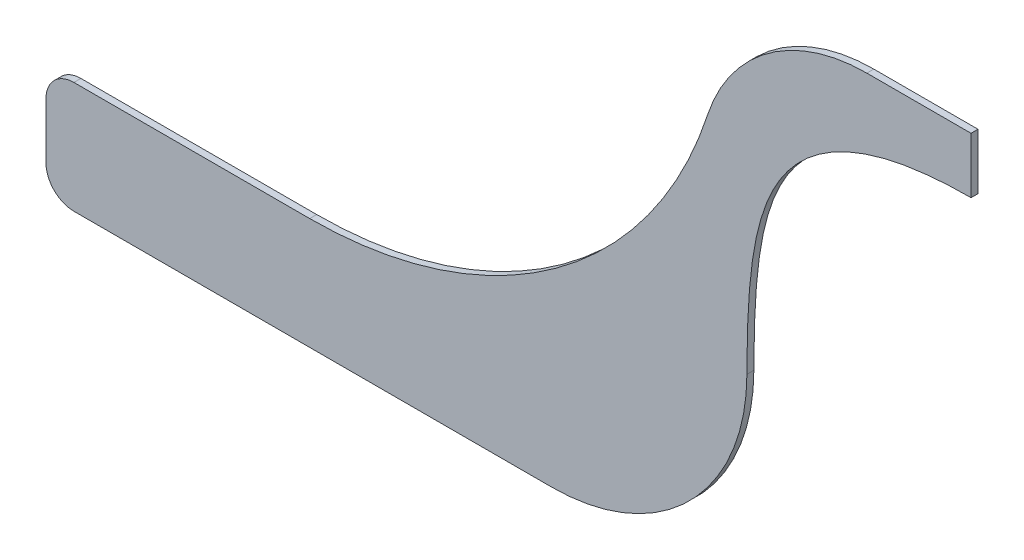
ISO-10303-21;
HEADER;
FILE_DESCRIPTION(('STEP AP214'),'2;1');
FILE_NAME('part.step','',(''),(''),'','','');
FILE_SCHEMA(('AUTOMOTIVE_DESIGN { 1 0 10303 214 1 1 1 1 }'));
ENDSEC;
DATA;
#1=APPLICATION_CONTEXT('core data for automotive mechanical design processes');
#2=APPLICATION_PROTOCOL_DEFINITION('international standard','automotive_design',2000,#1);
#3=PRODUCT_CONTEXT('',#1,'mechanical');
#4=PRODUCT('Part','Part','',(#3));
#5=PRODUCT_RELATED_PRODUCT_CATEGORY('part','',(#4));
#6=PRODUCT_DEFINITION_FORMATION('','',#4);
#7=PRODUCT_DEFINITION_CONTEXT('part definition',#1,'design');
#8=PRODUCT_DEFINITION('design','',#6,#7);
#9=PRODUCT_DEFINITION_SHAPE('','',#8);
#10=(LENGTH_UNIT() NAMED_UNIT(*) SI_UNIT(.MILLI.,.METRE.));
#11=(NAMED_UNIT(*) PLANE_ANGLE_UNIT() SI_UNIT($,.RADIAN.));
#12=(NAMED_UNIT(*) SI_UNIT($,.STERADIAN.) SOLID_ANGLE_UNIT());
#13=UNCERTAINTY_MEASURE_WITH_UNIT(LENGTH_MEASURE(1.E-05),#10,'distance_accuracy_value','');
#14=(GEOMETRIC_REPRESENTATION_CONTEXT(3) GLOBAL_UNCERTAINTY_ASSIGNED_CONTEXT((#13)) GLOBAL_UNIT_ASSIGNED_CONTEXT((#10,
#11,#12)) REPRESENTATION_CONTEXT('',''));
#15=CARTESIAN_POINT('',(0.,0.,0.));
#16=DIRECTION('',(0.,0.,1.));
#17=DIRECTION('',(1.,0.,0.));
#18=AXIS2_PLACEMENT_3D('',#15,#16,#17);
#19=CARTESIAN_POINT('',(439.701599066543,116.84,6.35));
#20=DIRECTION('',(0.,0.,-1.));
#21=DIRECTION('',(-1.,0.,0.));
#22=AXIS2_PLACEMENT_3D('',#19,#20,#21);
#23=CYLINDRICAL_SURFACE('',#22,177.8);
#24=CARTESIAN_POINT('',(439.701599066543,116.84,0.));
#25=DIRECTION('',(0.,0.,1.));
#26=DIRECTION('',(1.,0.,0.));
#27=AXIS2_PLACEMENT_3D('',#24,#25,#26);
#28=CIRCLE('',#27,177.8);
#29=CARTESIAN_POINT('',(439.701599066543,-60.96,0.));
#30=VERTEX_POINT('',#29);
#31=CARTESIAN_POINT('',(617.501599066543,116.84,0.));
#32=VERTEX_POINT('',#31);
#33=EDGE_CURVE('E148',#30,#32,#28,.T.);
#34=ORIENTED_EDGE('',*,*,#33,.T.);
#35=DIRECTION('',(0.,0.,-1.));
#36=VECTOR('',#35,1.);
#37=CARTESIAN_POINT('',(617.501599066543,116.84,6.35));
#38=LINE('',#37,#36);
#39=CARTESIAN_POINT('',(617.501599066543,116.84,6.35));
#40=VERTEX_POINT('',#39);
#41=EDGE_CURVE('E11',#40,#32,#38,.T.);
#42=ORIENTED_EDGE('',*,*,#41,.F.);
#43=CARTESIAN_POINT('',(439.701599066543,116.84,6.35));
#44=DIRECTION('',(0.,0.,1.));
#45=DIRECTION('',(1.,0.,0.));
#46=AXIS2_PLACEMENT_3D('',#43,#44,#45);
#47=CIRCLE('',#46,177.8);
#48=CARTESIAN_POINT('',(439.701599066543,-60.96,6.35));
#49=VERTEX_POINT('',#48);
#50=EDGE_CURVE('E177',#49,#40,#47,.T.);
#51=ORIENTED_EDGE('',*,*,#50,.F.);
#52=DIRECTION('',(0.,0.,-1.));
#53=VECTOR('',#52,1.);
#54=CARTESIAN_POINT('',(439.701599066543,-60.96,6.35));
#55=LINE('',#54,#53);
#56=EDGE_CURVE('E144',#49,#30,#55,.T.);
#57=ORIENTED_EDGE('',*,*,#56,.T.);
#58=EDGE_LOOP('',(#34,#42,#51,#57));
#59=FACE_BOUND('',#58,.T.);
#60=ADVANCED_FACE('F35',(#59),#23,.T.);
#61=CARTESIAN_POINT('',(617.501599066543,116.84,6.35));
#62=CARTESIAN_POINT('',(617.501599066543,198.103261629426,6.35));
#63=CARTESIAN_POINT('',(630.412866299136,310.676777219909,6.35));
#64=CARTESIAN_POINT('',(736.575869497677,358.14,6.35));
#65=CARTESIAN_POINT('',(821.560436262669,358.14,6.35));
#66=B_SPLINE_CURVE_WITH_KNOTS('',3,(#61,#62,#63,#64,#65),.UNSPECIFIED.,.F.,.F.,(4,1,4),(0.,
0.504521353823793,1.),.UNSPECIFIED.);
#67=DIRECTION('',(0.,0.,-1.));
#68=VECTOR('',#67,1.);
#69=SURFACE_OF_LINEAR_EXTRUSION('',#66,#68);
#70=CARTESIAN_POINT('',(617.501599066543,116.84,0.));
#71=CARTESIAN_POINT('',(617.501599066543,198.103261629426,0.));
#72=CARTESIAN_POINT('',(630.412866299136,310.676777219909,0.));
#73=CARTESIAN_POINT('',(736.575869497677,358.14,0.));
#74=CARTESIAN_POINT('',(821.560436262669,358.14,0.));
#75=B_SPLINE_CURVE_WITH_KNOTS('',3,(#70,#71,#72,#73,#74),.UNSPECIFIED.,.F.,.F.,(4,1,4),(0.,
0.504521353823793,1.),.UNSPECIFIED.);
#76=CARTESIAN_POINT('',(821.560436262669,358.14,0.));
#77=VERTEX_POINT('',#76);
#78=EDGE_CURVE('E151',#32,#77,#75,.T.);
#79=ORIENTED_EDGE('',*,*,#78,.T.);
#80=DIRECTION('',(0.,0.,-1.));
#81=VECTOR('',#80,1.);
#82=CARTESIAN_POINT('',(821.560436262669,358.14,6.35));
#83=LINE('',#82,#81);
#84=CARTESIAN_POINT('',(821.560436262669,358.14,6.35));
#85=VERTEX_POINT('',#84);
#86=EDGE_CURVE('E43',#85,#77,#83,.T.);
#87=ORIENTED_EDGE('',*,*,#86,.F.);
#88=EDGE_CURVE('E103',#40,#85,#66,.T.);
#89=ORIENTED_EDGE('',*,*,#88,.F.);
#90=ORIENTED_EDGE('',*,*,#41,.T.);
#91=EDGE_LOOP('',(#79,#87,#89,#90));
#92=FACE_BOUND('',#91,.T.);
#93=ADVANCED_FACE('F242',(#92),#69,.F.);
#94=CARTESIAN_POINT('',(821.560436262669,0.,6.35));
#95=DIRECTION('',(-1.,0.,0.));
#96=DIRECTION('',(0.,0.,1.));
#97=AXIS2_PLACEMENT_3D('',#94,#95,#96);
#98=PLANE('',#97);
#99=DIRECTION('',(0.,1.,0.));
#100=VECTOR('',#99,1.);
#101=CARTESIAN_POINT('',(821.560436262669,0.,0.));
#102=LINE('',#101,#100);
#103=CARTESIAN_POINT('',(821.560436262669,408.94,0.));
#104=VERTEX_POINT('',#103);
#105=EDGE_CURVE('E155',#77,#104,#102,.T.);
#106=ORIENTED_EDGE('',*,*,#105,.T.);
#107=DIRECTION('',(0.,0.,-1.));
#108=VECTOR('',#107,1.);
#109=CARTESIAN_POINT('',(821.560436262669,408.94,6.35));
#110=LINE('',#109,#108);
#111=CARTESIAN_POINT('',(821.560436262669,408.94,6.35));
#112=VERTEX_POINT('',#111);
#113=EDGE_CURVE('E190',#112,#104,#110,.T.);
#114=ORIENTED_EDGE('',*,*,#113,.F.);
#115=DIRECTION('',(0.,1.,0.));
#116=VECTOR('',#115,1.);
#117=CARTESIAN_POINT('',(821.560436262669,0.,6.35));
#118=LINE('',#117,#116);
#119=EDGE_CURVE('E198',#85,#112,#118,.T.);
#120=ORIENTED_EDGE('',*,*,#119,.F.);
#121=ORIENTED_EDGE('',*,*,#86,.T.);
#122=EDGE_LOOP('',(#106,#114,#120,#121));
#123=FACE_BOUND('',#122,.T.);
#124=ADVANCED_FACE('F196',(#123),#98,.F.);
#125=CARTESIAN_POINT('',(0.,408.94,6.35));
#126=DIRECTION('',(0.,-1.,0.));
#127=DIRECTION('',(0.,0.,-1.));
#128=AXIS2_PLACEMENT_3D('',#125,#126,#127);
#129=PLANE('',#128);
#130=DIRECTION('',(-1.,0.,0.));
#131=VECTOR('',#130,1.);
#132=CARTESIAN_POINT('',(0.,408.94,0.));
#133=LINE('',#132,#131);
#134=CARTESIAN_POINT('',(726.691494057482,408.94,0.));
#135=VERTEX_POINT('',#134);
#136=EDGE_CURVE('E160',#104,#135,#133,.T.);
#137=ORIENTED_EDGE('',*,*,#136,.T.);
#138=DIRECTION('',(0.,0.,-1.));
#139=VECTOR('',#138,1.);
#140=CARTESIAN_POINT('',(726.691494057482,408.94,6.35));
#141=LINE('',#140,#139);
#142=CARTESIAN_POINT('',(726.691494057482,408.94,6.35));
#143=VERTEX_POINT('',#142);
#144=EDGE_CURVE('E187',#143,#135,#141,.T.);
#145=ORIENTED_EDGE('',*,*,#144,.F.);
#146=DIRECTION('',(-1.,0.,0.));
#147=VECTOR('',#146,1.);
#148=CARTESIAN_POINT('',(0.,408.94,6.35));
#149=LINE('',#148,#147);
#150=EDGE_CURVE('E216',#112,#143,#149,.T.);
#151=ORIENTED_EDGE('',*,*,#150,.F.);
#152=ORIENTED_EDGE('',*,*,#113,.T.);
#153=EDGE_LOOP('',(#137,#145,#151,#152));
#154=FACE_BOUND('',#153,.T.);
#155=ADVANCED_FACE('F206',(#154),#129,.F.);
#156=CARTESIAN_POINT('',(726.691494057482,256.54,6.35));
#157=DIRECTION('',(0.,0.,-1.));
#158=DIRECTION('',(-1.,0.,0.));
#159=AXIS2_PLACEMENT_3D('',#156,#157,#158);
#160=CYLINDRICAL_SURFACE('',#159,152.4);
#161=CARTESIAN_POINT('',(726.691494057482,256.54,0.));
#162=DIRECTION('',(0.,0.,1.));
#163=DIRECTION('',(1.,0.,0.));
#164=AXIS2_PLACEMENT_3D('',#161,#162,#163);
#165=CIRCLE('',#164,152.4);
#166=CARTESIAN_POINT('',(581.77560008263,303.711428571429,0.));
#167=VERTEX_POINT('',#166);
#168=EDGE_CURVE('E162',#135,#167,#165,.T.);
#169=ORIENTED_EDGE('',*,*,#168,.T.);
#170=DIRECTION('',(0.,0.,-1.));
#171=VECTOR('',#170,1.);
#172=CARTESIAN_POINT('',(581.77560008263,303.711428571429,6.35));
#173=LINE('',#172,#171);
#174=CARTESIAN_POINT('',(581.77560008263,303.711428571429,6.35));
#175=VERTEX_POINT('',#174);
#176=EDGE_CURVE('E185',#175,#167,#173,.T.);
#177=ORIENTED_EDGE('',*,*,#176,.F.);
#178=CARTESIAN_POINT('',(726.691494057482,256.54,6.35));
#179=DIRECTION('',(0.,0.,1.));
#180=DIRECTION('',(1.,0.,0.));
#181=AXIS2_PLACEMENT_3D('',#178,#179,#180);
#182=CIRCLE('',#181,152.4);
#183=EDGE_CURVE('E212',#143,#175,#182,.T.);
#184=ORIENTED_EDGE('',*,*,#183,.F.);
#185=ORIENTED_EDGE('',*,*,#144,.T.);
#186=EDGE_LOOP('',(#169,#177,#184,#185));
#187=FACE_BOUND('',#186,.T.);
#188=ADVANCED_FACE('F210',(#187),#160,.T.);
#189=CARTESIAN_POINT('',(219.485865145499,421.64,6.35));
#190=DIRECTION('',(0.,0.,-1.));
#191=DIRECTION('',(-1.,0.,0.));
#192=AXIS2_PLACEMENT_3D('',#189,#190,#191);
#193=CYLINDRICAL_SURFACE('',#192,381.);
#194=CARTESIAN_POINT('',(219.485865145499,421.64,0.));
#195=DIRECTION('',(0.,0.,1.));
#196=DIRECTION('',(1.,0.,0.));
#197=AXIS2_PLACEMENT_3D('',#194,#195,#196);
#198=CIRCLE('',#197,381.);
#199=CARTESIAN_POINT('',(219.485865145499,40.64,0.));
#200=VERTEX_POINT('',#199);
#201=EDGE_CURVE('E165',#200,#167,#198,.T.);
#202=ORIENTED_EDGE('',*,*,#201,.F.);
#203=DIRECTION('',(0.,0.,-1.));
#204=VECTOR('',#203,1.);
#205=CARTESIAN_POINT('',(219.485865145499,40.64,6.35));
#206=LINE('',#205,#204);
#207=CARTESIAN_POINT('',(219.485865145499,40.64,6.35));
#208=VERTEX_POINT('',#207);
#209=EDGE_CURVE('E183',#208,#200,#206,.T.);
#210=ORIENTED_EDGE('',*,*,#209,.F.);
#211=CARTESIAN_POINT('',(219.485865145499,421.64,6.35));
#212=DIRECTION('',(0.,0.,1.));
#213=DIRECTION('',(1.,0.,0.));
#214=AXIS2_PLACEMENT_3D('',#211,#212,#213);
#215=CIRCLE('',#214,381.);
#216=EDGE_CURVE('E215',#208,#175,#215,.T.);
#217=ORIENTED_EDGE('',*,*,#216,.T.);
#218=ORIENTED_EDGE('',*,*,#176,.T.);
#219=EDGE_LOOP('',(#202,#210,#217,#218));
#220=FACE_BOUND('',#219,.T.);
#221=ADVANCED_FACE('F263',(#220),#193,.F.);
#222=CARTESIAN_POINT('',(0.,40.6399999999998,6.35));
#223=DIRECTION('',(0.,-1.,0.));
#224=DIRECTION('',(1.,0.,0.));
#225=AXIS2_PLACEMENT_3D('',#222,#223,#224);
#226=PLANE('',#225);
#227=DIRECTION('',(-1.,0.,0.));
#228=VECTOR('',#227,1.);
#229=CARTESIAN_POINT('',(0.,40.6399999999998,0.));
#230=LINE('',#229,#228);
#231=CARTESIAN_POINT('',(4.79079832994764,40.6399999999998,0.));
#232=VERTEX_POINT('',#231);
#233=EDGE_CURVE('E168',#200,#232,#230,.T.);
#234=ORIENTED_EDGE('',*,*,#233,.T.);
#235=DIRECTION('',(0.,0.,-1.));
#236=VECTOR('',#235,1.);
#237=CARTESIAN_POINT('',(4.79079832994764,40.6399999999998,6.35));
#238=LINE('',#237,#236);
#239=CARTESIAN_POINT('',(4.79079832994764,40.6399999999998,6.35));
#240=VERTEX_POINT('',#239);
#241=EDGE_CURVE('E181',#240,#232,#238,.T.);
#242=ORIENTED_EDGE('',*,*,#241,.F.);
#243=DIRECTION('',(-1.,0.,0.));
#244=VECTOR('',#243,1.);
#245=CARTESIAN_POINT('',(0.,40.6399999999998,6.35));
#246=LINE('',#245,#244);
#247=EDGE_CURVE('E218',#208,#240,#246,.T.);
#248=ORIENTED_EDGE('',*,*,#247,.F.);
#249=ORIENTED_EDGE('',*,*,#209,.T.);
#250=EDGE_LOOP('',(#234,#242,#248,#249));
#251=FACE_BOUND('',#250,.T.);
#252=ADVANCED_FACE('F266',(#251),#226,.F.);
#253=CARTESIAN_POINT('',(4.79079832994763,15.2399999999998,6.35));
#254=DIRECTION('',(0.,0.,-1.));
#255=DIRECTION('',(-1.,0.,0.));
#256=AXIS2_PLACEMENT_3D('',#253,#254,#255);
#257=CYLINDRICAL_SURFACE('',#256,25.4);
#258=CARTESIAN_POINT('',(4.79079832994763,15.2399999999998,0.));
#259=DIRECTION('',(0.,0.,1.));
#260=DIRECTION('',(1.,0.,0.));
#261=AXIS2_PLACEMENT_3D('',#258,#259,#260);
#262=CIRCLE('',#261,25.4);
#263=CARTESIAN_POINT('',(-20.6092016700524,15.2399999999998,0.));
#264=VERTEX_POINT('',#263);
#265=EDGE_CURVE('E171',#264,#232,#262,.F.);
#266=ORIENTED_EDGE('',*,*,#265,.F.);
#267=DIRECTION('',(0.,0.,-1.));
#268=VECTOR('',#267,1.);
#269=CARTESIAN_POINT('',(-20.6092016700524,15.2399999999998,6.35));
#270=LINE('',#269,#268);
#271=CARTESIAN_POINT('',(-20.6092016700524,15.2399999999998,6.35));
#272=VERTEX_POINT('',#271);
#273=EDGE_CURVE('E139',#272,#264,#270,.T.);
#274=ORIENTED_EDGE('',*,*,#273,.F.);
#275=CARTESIAN_POINT('',(4.79079832994763,15.2399999999998,6.35));
#276=DIRECTION('',(0.,0.,1.));
#277=DIRECTION('',(1.,0.,0.));
#278=AXIS2_PLACEMENT_3D('',#275,#276,#277);
#279=CIRCLE('',#278,25.4);
#280=EDGE_CURVE('E132',#272,#240,#279,.F.);
#281=ORIENTED_EDGE('',*,*,#280,.T.);
#282=ORIENTED_EDGE('',*,*,#241,.T.);
#283=EDGE_LOOP('',(#266,#274,#281,#282));
#284=FACE_BOUND('',#283,.T.);
#285=ADVANCED_FACE('F225',(#284),#257,.T.);
#286=CARTESIAN_POINT('',(-20.6092016700524,0.,6.35));
#287=DIRECTION('',(1.,0.,0.));
#288=DIRECTION('',(0.,0.,-1.));
#289=AXIS2_PLACEMENT_3D('',#286,#287,#288);
#290=PLANE('',#289);
#291=DIRECTION('',(0.,-1.,0.));
#292=VECTOR('',#291,1.);
#293=CARTESIAN_POINT('',(-20.6092016700524,0.,0.));
#294=LINE('',#293,#292);
#295=CARTESIAN_POINT('',(-20.6092016700524,-35.56,0.));
#296=VERTEX_POINT('',#295);
#297=EDGE_CURVE('E138',#264,#296,#294,.T.);
#298=ORIENTED_EDGE('',*,*,#297,.T.);
#299=DIRECTION('',(0.,0.,-1.));
#300=VECTOR('',#299,1.);
#301=CARTESIAN_POINT('',(-20.6092016700524,-35.56,6.35));
#302=LINE('',#301,#300);
#303=CARTESIAN_POINT('',(-20.6092016700524,-35.56,6.35));
#304=VERTEX_POINT('',#303);
#305=EDGE_CURVE('E135',#304,#296,#302,.T.);
#306=ORIENTED_EDGE('',*,*,#305,.F.);
#307=DIRECTION('',(0.,-1.,0.));
#308=VECTOR('',#307,1.);
#309=CARTESIAN_POINT('',(-20.6092016700524,0.,6.35));
#310=LINE('',#309,#308);
#311=EDGE_CURVE('E126',#272,#304,#310,.T.);
#312=ORIENTED_EDGE('',*,*,#311,.F.);
#313=ORIENTED_EDGE('',*,*,#273,.T.);
#314=EDGE_LOOP('',(#298,#306,#312,#313));
#315=FACE_BOUND('',#314,.T.);
#316=ADVANCED_FACE('F136',(#315),#290,.F.);
#317=CARTESIAN_POINT('',(4.79079832994762,-35.56,6.35));
#318=DIRECTION('',(0.,0.,-1.));
#319=DIRECTION('',(-1.,0.,0.));
#320=AXIS2_PLACEMENT_3D('',#317,#318,#319);
#321=CYLINDRICAL_SURFACE('',#320,25.4);
#322=CARTESIAN_POINT('',(4.79079832994762,-35.56,0.));
#323=DIRECTION('',(0.,0.,1.));
#324=DIRECTION('',(1.,0.,0.));
#325=AXIS2_PLACEMENT_3D('',#322,#323,#324);
#326=CIRCLE('',#325,25.4);
#327=CARTESIAN_POINT('',(4.79079832994763,-60.96,0.));
#328=VERTEX_POINT('',#327);
#329=EDGE_CURVE('E89',#296,#328,#326,.T.);
#330=ORIENTED_EDGE('',*,*,#329,.T.);
#331=DIRECTION('',(0.,0.,-1.));
#332=VECTOR('',#331,1.);
#333=CARTESIAN_POINT('',(4.79079832994763,-60.96,6.35));
#334=LINE('',#333,#332);
#335=CARTESIAN_POINT('',(4.79079832994763,-60.96,6.35));
#336=VERTEX_POINT('',#335);
#337=EDGE_CURVE('E140',#336,#328,#334,.T.);
#338=ORIENTED_EDGE('',*,*,#337,.F.);
#339=CARTESIAN_POINT('',(4.79079832994762,-35.56,6.35));
#340=DIRECTION('',(0.,0.,1.));
#341=DIRECTION('',(1.,0.,0.));
#342=AXIS2_PLACEMENT_3D('',#339,#340,#341);
#343=CIRCLE('',#342,25.4);
#344=EDGE_CURVE('E130',#304,#336,#343,.T.);
#345=ORIENTED_EDGE('',*,*,#344,.F.);
#346=ORIENTED_EDGE('',*,*,#305,.T.);
#347=EDGE_LOOP('',(#330,#338,#345,#346));
#348=FACE_BOUND('',#347,.T.);
#349=ADVANCED_FACE('F142',(#348),#321,.T.);
#350=CARTESIAN_POINT('',(0.,-60.96,6.35));
#351=DIRECTION('',(0.,1.,0.));
#352=DIRECTION('',(-1.,0.,0.));
#353=AXIS2_PLACEMENT_3D('',#350,#351,#352);
#354=PLANE('',#353);
#355=DIRECTION('',(1.,0.,0.));
#356=VECTOR('',#355,1.);
#357=CARTESIAN_POINT('',(0.,-60.96,0.));
#358=LINE('',#357,#356);
#359=EDGE_CURVE('E95',#328,#30,#358,.T.);
#360=ORIENTED_EDGE('',*,*,#359,.T.);
#361=ORIENTED_EDGE('',*,*,#56,.F.);
#362=DIRECTION('',(1.,0.,0.));
#363=VECTOR('',#362,1.);
#364=CARTESIAN_POINT('',(0.,-60.96,6.35));
#365=LINE('',#364,#363);
#366=EDGE_CURVE('E51',#336,#49,#365,.T.);
#367=ORIENTED_EDGE('',*,*,#366,.F.);
#368=ORIENTED_EDGE('',*,*,#337,.T.);
#369=EDGE_LOOP('',(#360,#361,#367,#368));
#370=FACE_BOUND('',#369,.T.);
#371=ADVANCED_FACE('F231',(#370),#354,.F.);
#372=CARTESIAN_POINT('',(0.,0.,6.35));
#373=DIRECTION('',(0.,0.,1.));
#374=DIRECTION('',(1.,0.,0.));
#375=AXIS2_PLACEMENT_3D('',#372,#373,#374);
#376=PLANE('',#375);
#377=ORIENTED_EDGE('',*,*,#50,.T.);
#378=ORIENTED_EDGE('',*,*,#88,.T.);
#379=ORIENTED_EDGE('',*,*,#119,.T.);
#380=ORIENTED_EDGE('',*,*,#150,.T.);
#381=ORIENTED_EDGE('',*,*,#183,.T.);
#382=ORIENTED_EDGE('',*,*,#216,.F.);
#383=ORIENTED_EDGE('',*,*,#247,.T.);
#384=ORIENTED_EDGE('',*,*,#280,.F.);
#385=ORIENTED_EDGE('',*,*,#311,.T.);
#386=ORIENTED_EDGE('',*,*,#344,.T.);
#387=ORIENTED_EDGE('',*,*,#366,.T.);
#388=EDGE_LOOP('',(#377,#378,#379,#380,#381,#382,#383,#384,#385,#386,#387));
#389=FACE_BOUND('',#388,.T.);
#390=ADVANCED_FACE('F128',(#389),#376,.T.);
#391=CARTESIAN_POINT('',(0.,0.,0.));
#392=DIRECTION('',(0.,0.,1.));
#393=DIRECTION('',(1.,0.,0.));
#394=AXIS2_PLACEMENT_3D('',#391,#392,#393);
#395=PLANE('',#394);
#396=ORIENTED_EDGE('',*,*,#33,.F.);
#397=ORIENTED_EDGE('',*,*,#359,.F.);
#398=ORIENTED_EDGE('',*,*,#329,.F.);
#399=ORIENTED_EDGE('',*,*,#297,.F.);
#400=ORIENTED_EDGE('',*,*,#265,.T.);
#401=ORIENTED_EDGE('',*,*,#233,.F.);
#402=ORIENTED_EDGE('',*,*,#201,.T.);
#403=ORIENTED_EDGE('',*,*,#168,.F.);
#404=ORIENTED_EDGE('',*,*,#136,.F.);
#405=ORIENTED_EDGE('',*,*,#105,.F.);
#406=ORIENTED_EDGE('',*,*,#78,.F.);
#407=EDGE_LOOP('',(#396,#397,#398,#399,#400,#401,#402,#403,#404,#405,#406));
#408=FACE_BOUND('',#407,.T.);
#409=ADVANCED_FACE('F202',(#408),#395,.F.);
#410=CLOSED_SHELL('',(#60,#93,#124,#155,#188,#221,#252,#285,#316,#349,#371,#390,#409));
#411=MANIFOLD_SOLID_BREP('B2',#410);
#412=ADVANCED_BREP_SHAPE_REPRESENTATION('',(#18,#411),#14);
#413=SHAPE_DEFINITION_REPRESENTATION(#9,#412);
ENDSEC;
END-ISO-10303-21;
